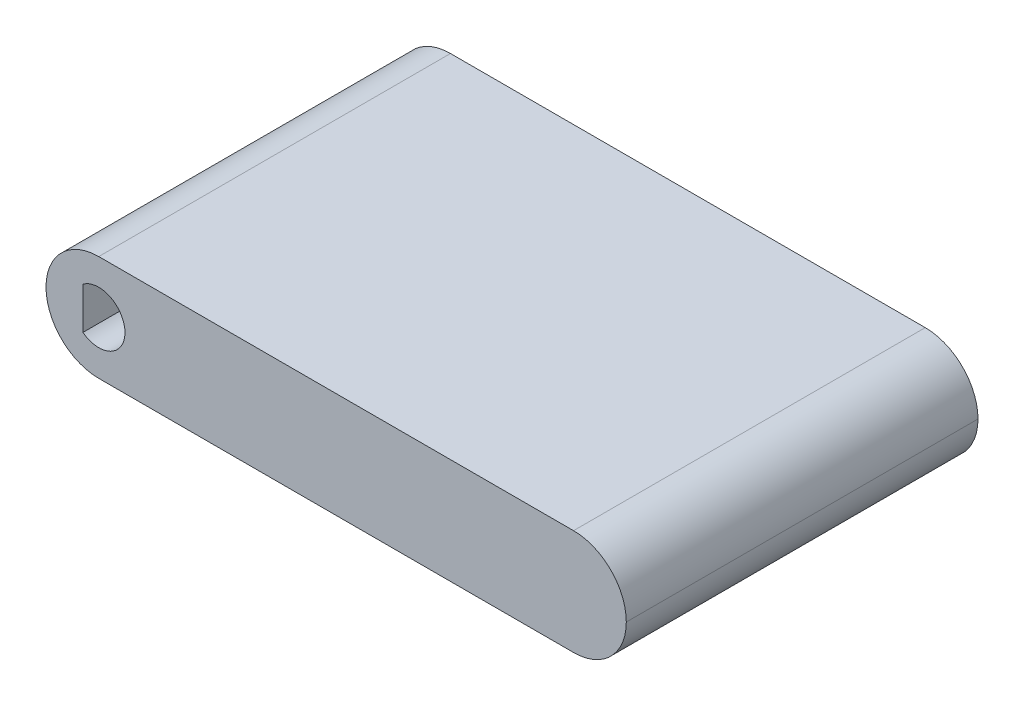
ISO-10303-21;
HEADER;
FILE_DESCRIPTION(('STEP AP214'),'2;1');
FILE_NAME('part.step','',(''),(''),'','','');
FILE_SCHEMA(('AUTOMOTIVE_DESIGN { 1 0 10303 214 1 1 1 1 }'));
ENDSEC;
DATA;
#1=APPLICATION_CONTEXT('core data for automotive mechanical design processes');
#2=APPLICATION_PROTOCOL_DEFINITION('international standard','automotive_design',2000,#1);
#3=PRODUCT_CONTEXT('',#1,'mechanical');
#4=PRODUCT('Part','Part','',(#3));
#5=PRODUCT_RELATED_PRODUCT_CATEGORY('part','',(#4));
#6=PRODUCT_DEFINITION_FORMATION('','',#4);
#7=PRODUCT_DEFINITION_CONTEXT('part definition',#1,'design');
#8=PRODUCT_DEFINITION('design','',#6,#7);
#9=PRODUCT_DEFINITION_SHAPE('','',#8);
#10=(LENGTH_UNIT() NAMED_UNIT(*) SI_UNIT(.MILLI.,.METRE.));
#11=(NAMED_UNIT(*) PLANE_ANGLE_UNIT() SI_UNIT($,.RADIAN.));
#12=(NAMED_UNIT(*) SI_UNIT($,.STERADIAN.) SOLID_ANGLE_UNIT());
#13=UNCERTAINTY_MEASURE_WITH_UNIT(LENGTH_MEASURE(1.E-05),#10,'distance_accuracy_value','');
#14=(GEOMETRIC_REPRESENTATION_CONTEXT(3) GLOBAL_UNCERTAINTY_ASSIGNED_CONTEXT((#13)) GLOBAL_UNIT_ASSIGNED_CONTEXT((#10,
#11,#12)) REPRESENTATION_CONTEXT('',''));
#15=CARTESIAN_POINT('',(0.,0.,0.));
#16=DIRECTION('',(0.,0.,1.));
#17=DIRECTION('',(1.,0.,0.));
#18=AXIS2_PLACEMENT_3D('',#15,#16,#17);
#19=CARTESIAN_POINT('',(0.,0.,20.));
#20=DIRECTION('',(0.,0.,1.));
#21=DIRECTION('',(1.,0.,0.));
#22=AXIS2_PLACEMENT_3D('',#19,#20,#21);
#23=PLANE('',#22);
#24=DIRECTION('',(1.,0.,0.));
#25=VECTOR('',#24,1.);
#26=CARTESIAN_POINT('',(-6.,-6.,20.));
#27=LINE('',#26,#25);
#28=CARTESIAN_POINT('',(0.,-6.,20.));
#29=VERTEX_POINT('',#28);
#30=CARTESIAN_POINT('',(54.,-6.,20.));
#31=VERTEX_POINT('',#30);
#32=EDGE_CURVE('E126',#29,#31,#27,.T.);
#33=ORIENTED_EDGE('',*,*,#32,.T.);
#34=CARTESIAN_POINT('',(54.,0.,20.));
#35=DIRECTION('',(0.,0.,1.));
#36=DIRECTION('',(1.,0.,0.));
#37=AXIS2_PLACEMENT_3D('',#34,#35,#36);
#38=CIRCLE('',#37,6.);
#39=CARTESIAN_POINT('',(60.,0.,20.));
#40=VERTEX_POINT('',#39);
#41=EDGE_CURVE('E157',#31,#40,#38,.T.);
#42=ORIENTED_EDGE('',*,*,#41,.T.);
#43=CARTESIAN_POINT('',(54.,0.,20.));
#44=DIRECTION('',(0.,0.,1.));
#45=DIRECTION('',(1.,0.,0.));
#46=AXIS2_PLACEMENT_3D('',#43,#44,#45);
#47=CIRCLE('',#46,6.);
#48=CARTESIAN_POINT('',(54.,6.00000000000001,20.));
#49=VERTEX_POINT('',#48);
#50=EDGE_CURVE('E155',#40,#49,#47,.T.);
#51=ORIENTED_EDGE('',*,*,#50,.T.);
#52=DIRECTION('',(-1.,0.,0.));
#53=VECTOR('',#52,1.);
#54=CARTESIAN_POINT('',(60.,6.00000000000002,20.));
#55=LINE('',#54,#53);
#56=CARTESIAN_POINT('',(0.,6.,20.));
#57=VERTEX_POINT('',#56);
#58=EDGE_CURVE('E129',#49,#57,#55,.T.);
#59=ORIENTED_EDGE('',*,*,#58,.T.);
#60=CARTESIAN_POINT('',(0.,0.,20.));
#61=DIRECTION('',(0.,0.,1.));
#62=DIRECTION('',(1.,0.,0.));
#63=AXIS2_PLACEMENT_3D('',#60,#61,#62);
#64=CIRCLE('',#63,6.);
#65=CARTESIAN_POINT('',(-6.,0.,20.));
#66=VERTEX_POINT('',#65);
#67=EDGE_CURVE('E151',#57,#66,#64,.T.);
#68=ORIENTED_EDGE('',*,*,#67,.T.);
#69=CARTESIAN_POINT('',(0.,0.,20.));
#70=DIRECTION('',(0.,0.,1.));
#71=DIRECTION('',(1.,0.,0.));
#72=AXIS2_PLACEMENT_3D('',#69,#70,#71);
#73=CIRCLE('',#72,6.);
#74=EDGE_CURVE('E153',#66,#29,#73,.T.);
#75=ORIENTED_EDGE('',*,*,#74,.T.);
#76=EDGE_LOOP('',(#33,#42,#51,#59,#68,#75));
#77=FACE_BOUND('',#76,.T.);
#78=CARTESIAN_POINT('',(0.,0.,20.));
#79=DIRECTION('',(0.,0.,1.));
#80=DIRECTION('',(1.,0.,0.));
#81=AXIS2_PLACEMENT_3D('',#78,#79,#80);
#82=CIRCLE('',#81,2.98);
#83=CARTESIAN_POINT('',(-1.8,-2.37495263110657,20.));
#84=VERTEX_POINT('',#83);
#85=CARTESIAN_POINT('',(-1.8,2.37495263110657,20.));
#86=VERTEX_POINT('',#85);
#87=EDGE_CURVE('E105',#84,#86,#82,.T.);
#88=ORIENTED_EDGE('',*,*,#87,.F.);
#89=DIRECTION('',(0.,-1.,0.));
#90=VECTOR('',#89,1.);
#91=CARTESIAN_POINT('',(-1.8,-2.37495263110657,20.));
#92=LINE('',#91,#90);
#93=EDGE_CURVE('E113',#86,#84,#92,.T.);
#94=ORIENTED_EDGE('',*,*,#93,.F.);
#95=EDGE_LOOP('',(#88,#94));
#96=FACE_BOUND('',#95,.T.);
#97=ADVANCED_FACE('F43',(#77,#96),#23,.T.);
#98=CARTESIAN_POINT('',(0.,0.,-20.));
#99=DIRECTION('',(0.,0.,1.));
#100=DIRECTION('',(1.,0.,0.));
#101=AXIS2_PLACEMENT_3D('',#98,#99,#100);
#102=PLANE('',#101);
#103=CARTESIAN_POINT('',(54.,0.,-20.));
#104=DIRECTION('',(0.,0.,1.));
#105=DIRECTION('',(1.,0.,0.));
#106=AXIS2_PLACEMENT_3D('',#103,#104,#105);
#107=CIRCLE('',#106,6.);
#108=CARTESIAN_POINT('',(54.,6.00000000000001,-20.));
#109=VERTEX_POINT('',#108);
#110=CARTESIAN_POINT('',(60.,0.,-20.));
#111=VERTEX_POINT('',#110);
#112=EDGE_CURVE('E141',#109,#111,#107,.F.);
#113=ORIENTED_EDGE('',*,*,#112,.T.);
#114=CARTESIAN_POINT('',(54.,0.,-20.));
#115=DIRECTION('',(0.,0.,1.));
#116=DIRECTION('',(1.,0.,0.));
#117=AXIS2_PLACEMENT_3D('',#114,#115,#116);
#118=CIRCLE('',#117,6.);
#119=CARTESIAN_POINT('',(54.,-6.,-20.));
#120=VERTEX_POINT('',#119);
#121=EDGE_CURVE('E143',#111,#120,#118,.F.);
#122=ORIENTED_EDGE('',*,*,#121,.T.);
#123=DIRECTION('',(1.,0.,0.));
#124=VECTOR('',#123,1.);
#125=CARTESIAN_POINT('',(-6.,-6.,-20.));
#126=LINE('',#125,#124);
#127=CARTESIAN_POINT('',(0.,-6.,-20.));
#128=VERTEX_POINT('',#127);
#129=EDGE_CURVE('E111',#128,#120,#126,.T.);
#130=ORIENTED_EDGE('',*,*,#129,.F.);
#131=CARTESIAN_POINT('',(0.,0.,-20.));
#132=DIRECTION('',(0.,0.,1.));
#133=DIRECTION('',(1.,0.,0.));
#134=AXIS2_PLACEMENT_3D('',#131,#132,#133);
#135=CIRCLE('',#134,6.);
#136=CARTESIAN_POINT('',(-6.,0.,-20.));
#137=VERTEX_POINT('',#136);
#138=EDGE_CURVE('E139',#128,#137,#135,.F.);
#139=ORIENTED_EDGE('',*,*,#138,.T.);
#140=CARTESIAN_POINT('',(0.,0.,-20.));
#141=DIRECTION('',(0.,0.,1.));
#142=DIRECTION('',(1.,0.,0.));
#143=AXIS2_PLACEMENT_3D('',#140,#141,#142);
#144=CIRCLE('',#143,6.);
#145=CARTESIAN_POINT('',(0.,6.,-20.));
#146=VERTEX_POINT('',#145);
#147=EDGE_CURVE('E133',#137,#146,#144,.F.);
#148=ORIENTED_EDGE('',*,*,#147,.T.);
#149=DIRECTION('',(-1.,0.,0.));
#150=VECTOR('',#149,1.);
#151=CARTESIAN_POINT('',(60.,6.00000000000002,-20.));
#152=LINE('',#151,#150);
#153=EDGE_CURVE('E130',#109,#146,#152,.T.);
#154=ORIENTED_EDGE('',*,*,#153,.F.);
#155=EDGE_LOOP('',(#113,#122,#130,#139,#148,#154));
#156=FACE_BOUND('',#155,.T.);
#157=CARTESIAN_POINT('',(0.,0.,-20.));
#158=DIRECTION('',(0.,0.,1.));
#159=DIRECTION('',(1.,0.,0.));
#160=AXIS2_PLACEMENT_3D('',#157,#158,#159);
#161=CIRCLE('',#160,2.98);
#162=CARTESIAN_POINT('',(-1.8,-2.37495263110657,-20.));
#163=VERTEX_POINT('',#162);
#164=CARTESIAN_POINT('',(-1.8,2.37495263110657,-20.));
#165=VERTEX_POINT('',#164);
#166=EDGE_CURVE('E60',#163,#165,#161,.T.);
#167=ORIENTED_EDGE('',*,*,#166,.T.);
#168=DIRECTION('',(0.,-1.,0.));
#169=VECTOR('',#168,1.);
#170=CARTESIAN_POINT('',(-1.8,-2.37495263110657,-20.));
#171=LINE('',#170,#169);
#172=EDGE_CURVE('E115',#165,#163,#171,.T.);
#173=ORIENTED_EDGE('',*,*,#172,.T.);
#174=EDGE_LOOP('',(#167,#173));
#175=FACE_BOUND('',#174,.T.);
#176=ADVANCED_FACE('F189',(#156,#175),#102,.F.);
#177=CARTESIAN_POINT('',(-6.,-6.,20.));
#178=DIRECTION('',(0.,1.,0.));
#179=DIRECTION('',(0.,0.,1.));
#180=AXIS2_PLACEMENT_3D('',#177,#178,#179);
#181=PLANE('',#180);
#182=ORIENTED_EDGE('',*,*,#129,.T.);
#183=DIRECTION('',(0.,0.,-1.));
#184=VECTOR('',#183,1.);
#185=CARTESIAN_POINT('',(54.,-6.,20.));
#186=LINE('',#185,#184);
#187=EDGE_CURVE('E148',#120,#31,#186,.F.);
#188=ORIENTED_EDGE('',*,*,#187,.T.);
#189=ORIENTED_EDGE('',*,*,#32,.F.);
#190=DIRECTION('',(0.,0.,-1.));
#191=VECTOR('',#190,1.);
#192=CARTESIAN_POINT('',(0.,-6.,20.));
#193=LINE('',#192,#191);
#194=EDGE_CURVE('E145',#29,#128,#193,.T.);
#195=ORIENTED_EDGE('',*,*,#194,.T.);
#196=EDGE_LOOP('',(#182,#188,#189,#195));
#197=FACE_BOUND('',#196,.T.);
#198=ADVANCED_FACE('F185',(#197),#181,.F.);
#199=CARTESIAN_POINT('',(60.,6.00000000000002,20.));
#200=DIRECTION('',(0.,-1.,0.));
#201=DIRECTION('',(1.,0.,0.));
#202=AXIS2_PLACEMENT_3D('',#199,#200,#201);
#203=PLANE('',#202);
#204=ORIENTED_EDGE('',*,*,#58,.F.);
#205=DIRECTION('',(0.,0.,-1.));
#206=VECTOR('',#205,1.);
#207=CARTESIAN_POINT('',(54.,6.00000000000001,20.));
#208=LINE('',#207,#206);
#209=EDGE_CURVE('E11',#49,#109,#208,.T.);
#210=ORIENTED_EDGE('',*,*,#209,.T.);
#211=ORIENTED_EDGE('',*,*,#153,.T.);
#212=DIRECTION('',(0.,0.,-1.));
#213=VECTOR('',#212,1.);
#214=CARTESIAN_POINT('',(0.,6.,20.));
#215=LINE('',#214,#213);
#216=EDGE_CURVE('E52',#146,#57,#215,.F.);
#217=ORIENTED_EDGE('',*,*,#216,.T.);
#218=EDGE_LOOP('',(#204,#210,#211,#217));
#219=FACE_BOUND('',#218,.T.);
#220=ADVANCED_FACE('F174',(#219),#203,.F.);
#221=CARTESIAN_POINT('',(0.,0.,20.));
#222=DIRECTION('',(0.,0.,-1.));
#223=DIRECTION('',(-1.,0.,0.));
#224=AXIS2_PLACEMENT_3D('',#221,#222,#223);
#225=CYLINDRICAL_SURFACE('',#224,2.98);
#226=DIRECTION('',(0.,0.,-1.));
#227=VECTOR('',#226,1.);
#228=CARTESIAN_POINT('',(-1.8,-2.37495263110657,24.8942823784494));
#229=LINE('',#228,#227);
#230=EDGE_CURVE('E108',#84,#163,#229,.T.);
#231=ORIENTED_EDGE('',*,*,#230,.F.);
#232=ORIENTED_EDGE('',*,*,#87,.T.);
#233=DIRECTION('',(0.,0.,-1.));
#234=VECTOR('',#233,1.);
#235=CARTESIAN_POINT('',(-1.8,2.37495263110657,24.8942823784494));
#236=LINE('',#235,#234);
#237=EDGE_CURVE('E65',#86,#165,#236,.T.);
#238=ORIENTED_EDGE('',*,*,#237,.T.);
#239=ORIENTED_EDGE('',*,*,#166,.F.);
#240=EDGE_LOOP('',(#231,#232,#238,#239));
#241=FACE_BOUND('',#240,.T.);
#242=ADVANCED_FACE('F107',(#241),#225,.F.);
#243=CARTESIAN_POINT('',(54.,0.,20.));
#244=DIRECTION('',(0.,0.,-1.));
#245=DIRECTION('',(-1.,0.,0.));
#246=AXIS2_PLACEMENT_3D('',#243,#244,#245);
#247=CYLINDRICAL_SURFACE('',#246,6.);
#248=ORIENTED_EDGE('',*,*,#209,.F.);
#249=ORIENTED_EDGE('',*,*,#50,.F.);
#250=DIRECTION('',(0.,0.,-1.));
#251=VECTOR('',#250,1.);
#252=CARTESIAN_POINT('',(60.,0.,20.));
#253=LINE('',#252,#251);
#254=EDGE_CURVE('E122',#111,#40,#253,.F.);
#255=ORIENTED_EDGE('',*,*,#254,.F.);
#256=ORIENTED_EDGE('',*,*,#112,.F.);
#257=EDGE_LOOP('',(#248,#249,#255,#256));
#258=FACE_BOUND('',#257,.T.);
#259=ADVANCED_FACE('F169',(#258),#247,.T.);
#260=CARTESIAN_POINT('',(54.,0.,20.));
#261=DIRECTION('',(0.,0.,-1.));
#262=DIRECTION('',(-1.,0.,0.));
#263=AXIS2_PLACEMENT_3D('',#260,#261,#262);
#264=CYLINDRICAL_SURFACE('',#263,6.);
#265=ORIENTED_EDGE('',*,*,#41,.F.);
#266=ORIENTED_EDGE('',*,*,#187,.F.);
#267=ORIENTED_EDGE('',*,*,#121,.F.);
#268=ORIENTED_EDGE('',*,*,#254,.T.);
#269=EDGE_LOOP('',(#265,#266,#267,#268));
#270=FACE_BOUND('',#269,.T.);
#271=ADVANCED_FACE('F163',(#270),#264,.T.);
#272=CARTESIAN_POINT('',(0.,0.,20.));
#273=DIRECTION('',(0.,0.,-1.));
#274=DIRECTION('',(-1.,0.,0.));
#275=AXIS2_PLACEMENT_3D('',#272,#273,#274);
#276=CYLINDRICAL_SURFACE('',#275,6.);
#277=DIRECTION('',(0.,0.,-1.));
#278=VECTOR('',#277,1.);
#279=CARTESIAN_POINT('',(-6.,0.,20.));
#280=LINE('',#279,#278);
#281=EDGE_CURVE('E47',#66,#137,#280,.T.);
#282=ORIENTED_EDGE('',*,*,#281,.F.);
#283=ORIENTED_EDGE('',*,*,#67,.F.);
#284=ORIENTED_EDGE('',*,*,#216,.F.);
#285=ORIENTED_EDGE('',*,*,#147,.F.);
#286=EDGE_LOOP('',(#282,#283,#284,#285));
#287=FACE_BOUND('',#286,.T.);
#288=ADVANCED_FACE('F45',(#287),#276,.T.);
#289=CARTESIAN_POINT('',(0.,0.,20.));
#290=DIRECTION('',(0.,0.,-1.));
#291=DIRECTION('',(-1.,0.,0.));
#292=AXIS2_PLACEMENT_3D('',#289,#290,#291);
#293=CYLINDRICAL_SURFACE('',#292,6.);
#294=ORIENTED_EDGE('',*,*,#74,.F.);
#295=ORIENTED_EDGE('',*,*,#281,.T.);
#296=ORIENTED_EDGE('',*,*,#138,.F.);
#297=ORIENTED_EDGE('',*,*,#194,.F.);
#298=EDGE_LOOP('',(#294,#295,#296,#297));
#299=FACE_BOUND('',#298,.T.);
#300=ADVANCED_FACE('F187',(#299),#293,.T.);
#301=CARTESIAN_POINT('',(-1.8,-2.37495263110657,24.8942823784494));
#302=DIRECTION('',(1.,0.,0.));
#303=DIRECTION('',(0.,0.,-1.));
#304=AXIS2_PLACEMENT_3D('',#301,#302,#303);
#305=PLANE('',#304);
#306=ORIENTED_EDGE('',*,*,#237,.F.);
#307=ORIENTED_EDGE('',*,*,#93,.T.);
#308=ORIENTED_EDGE('',*,*,#230,.T.);
#309=ORIENTED_EDGE('',*,*,#172,.F.);
#310=EDGE_LOOP('',(#306,#307,#308,#309));
#311=FACE_BOUND('',#310,.T.);
#312=ADVANCED_FACE('F118',(#311),#305,.T.);
#313=CLOSED_SHELL('',(#97,#176,#198,#220,#242,#259,#271,#288,#300,#312));
#314=MANIFOLD_SOLID_BREP('B2',#313);
#315=ADVANCED_BREP_SHAPE_REPRESENTATION('',(#18,#314),#14);
#316=SHAPE_DEFINITION_REPRESENTATION(#9,#315);
ENDSEC;
END-ISO-10303-21;
